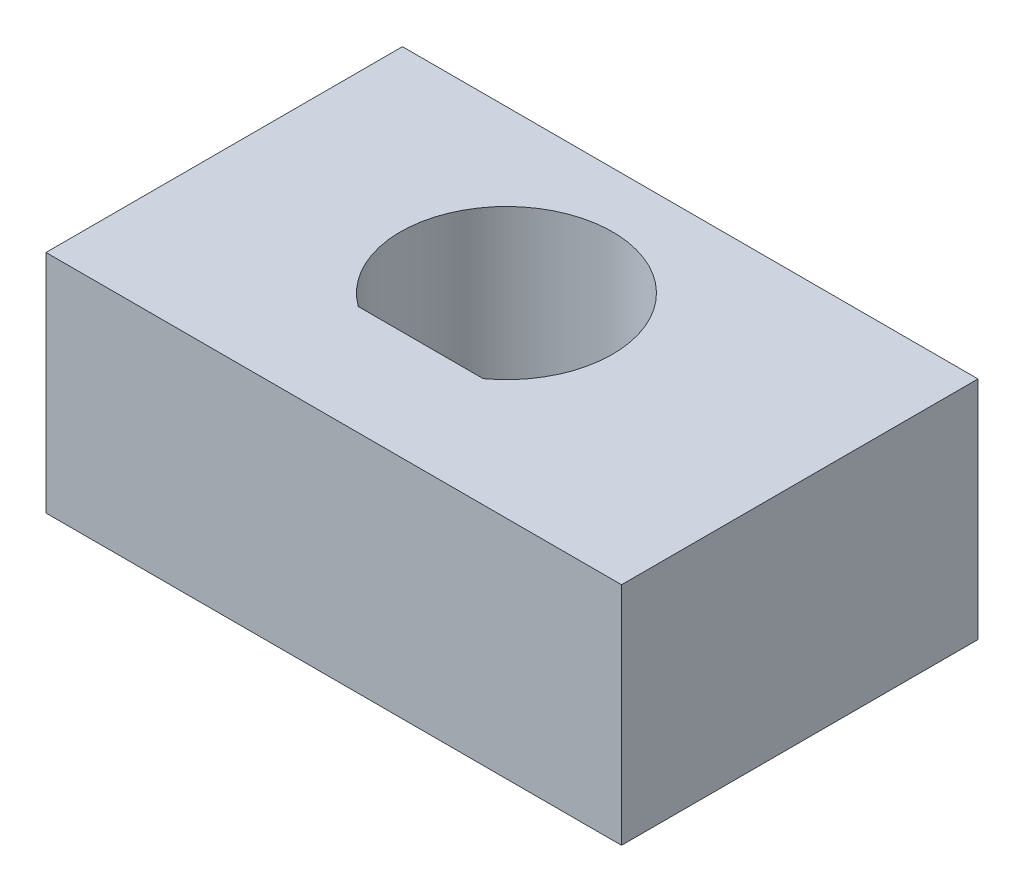
ISO-10303-21;
HEADER;
FILE_DESCRIPTION(('STEP AP214'),'2;1');
FILE_NAME('part.step','',(''),(''),'','','');
FILE_SCHEMA(('AUTOMOTIVE_DESIGN { 1 0 10303 214 1 1 1 1 }'));
ENDSEC;
DATA;
#1=APPLICATION_CONTEXT('core data for automotive mechanical design processes');
#2=APPLICATION_PROTOCOL_DEFINITION('international standard','automotive_design',2000,#1);
#3=PRODUCT_CONTEXT('',#1,'mechanical');
#4=PRODUCT('Part','Part','',(#3));
#5=PRODUCT_RELATED_PRODUCT_CATEGORY('part','',(#4));
#6=PRODUCT_DEFINITION_FORMATION('','',#4);
#7=PRODUCT_DEFINITION_CONTEXT('part definition',#1,'design');
#8=PRODUCT_DEFINITION('design','',#6,#7);
#9=PRODUCT_DEFINITION_SHAPE('','',#8);
#10=(LENGTH_UNIT() NAMED_UNIT(*) SI_UNIT(.MILLI.,.METRE.));
#11=(NAMED_UNIT(*) PLANE_ANGLE_UNIT() SI_UNIT($,.RADIAN.));
#12=(NAMED_UNIT(*) SI_UNIT($,.STERADIAN.) SOLID_ANGLE_UNIT());
#13=UNCERTAINTY_MEASURE_WITH_UNIT(LENGTH_MEASURE(1.E-05),#10,'distance_accuracy_value','');
#14=(GEOMETRIC_REPRESENTATION_CONTEXT(3) GLOBAL_UNCERTAINTY_ASSIGNED_CONTEXT((#13)) GLOBAL_UNIT_ASSIGNED_CONTEXT((#10,
#11,#12)) REPRESENTATION_CONTEXT('',''));
#15=CARTESIAN_POINT('',(0.,0.,0.));
#16=DIRECTION('',(0.,0.,1.));
#17=DIRECTION('',(1.,0.,0.));
#18=AXIS2_PLACEMENT_3D('',#15,#16,#17);
#19=CARTESIAN_POINT('',(0.,10.,0.));
#20=DIRECTION('',(0.,1.,0.));
#21=DIRECTION('',(0.,0.,1.));
#22=AXIS2_PLACEMENT_3D('',#19,#20,#21);
#23=PLANE('',#22);
#24=DIRECTION('',(0.,0.,1.));
#25=VECTOR('',#24,1.);
#26=CARTESIAN_POINT('',(-11.7589503531469,10.,-7.15100613724833));
#27=LINE('',#26,#25);
#28=CARTESIAN_POINT('',(-11.7589503531469,10.,-7.15100613724833));
#29=VERTEX_POINT('',#28);
#30=CARTESIAN_POINT('',(-11.7589503531469,10.,8.64232190253989));
#31=VERTEX_POINT('',#30);
#32=EDGE_CURVE('E115',#29,#31,#27,.T.);
#33=ORIENTED_EDGE('',*,*,#32,.T.);
#34=DIRECTION('',(1.,0.,0.));
#35=VECTOR('',#34,1.);
#36=CARTESIAN_POINT('',(-11.7589503531469,10.,8.64232190253989));
#37=LINE('',#36,#35);
#38=CARTESIAN_POINT('',(13.7404246243508,10.,8.64232190253989));
#39=VERTEX_POINT('',#38);
#40=EDGE_CURVE('E119',#31,#39,#37,.T.);
#41=ORIENTED_EDGE('',*,*,#40,.T.);
#42=DIRECTION('',(0.,0.,-1.));
#43=VECTOR('',#42,1.);
#44=CARTESIAN_POINT('',(13.7404246243508,10.,-7.15100613724833));
#45=LINE('',#44,#43);
#46=CARTESIAN_POINT('',(13.7404246243508,10.,-7.15100613724833));
#47=VERTEX_POINT('',#46);
#48=EDGE_CURVE('E123',#39,#47,#45,.T.);
#49=ORIENTED_EDGE('',*,*,#48,.T.);
#50=DIRECTION('',(-1.,0.,0.));
#51=VECTOR('',#50,1.);
#52=CARTESIAN_POINT('',(-11.7589503531469,10.,-7.15100613724833));
#53=LINE('',#52,#51);
#54=EDGE_CURVE('E126',#47,#29,#53,.T.);
#55=ORIENTED_EDGE('',*,*,#54,.T.);
#56=EDGE_LOOP('',(#33,#41,#49,#55));
#57=FACE_BOUND('',#56,.T.);
#58=DIRECTION('',(1.,0.,0.));
#59=VECTOR('',#58,1.);
#60=CARTESIAN_POINT('',(-2.76586333718787,10.,3.8));
#61=LINE('',#60,#59);
#62=CARTESIAN_POINT('',(-2.76586333718787,10.,3.8));
#63=VERTEX_POINT('',#62);
#64=CARTESIAN_POINT('',(2.76586333718787,10.,3.8));
#65=VERTEX_POINT('',#64);
#66=EDGE_CURVE('E92',#63,#65,#61,.T.);
#67=ORIENTED_EDGE('',*,*,#66,.F.);
#68=CARTESIAN_POINT('',(0.,10.,0.));
#69=DIRECTION('',(0.,1.,0.));
#70=DIRECTION('',(0.,0.,-1.));
#71=AXIS2_PLACEMENT_3D('',#68,#69,#70);
#72=CIRCLE('',#71,4.7);
#73=EDGE_CURVE('E99',#65,#63,#72,.T.);
#74=ORIENTED_EDGE('',*,*,#73,.F.);
#75=EDGE_LOOP('',(#67,#74));
#76=FACE_BOUND('',#75,.T.);
#77=ADVANCED_FACE('F39',(#57,#76),#23,.T.);
#78=CARTESIAN_POINT('',(0.,0.,0.));
#79=DIRECTION('',(0.,1.,0.));
#80=DIRECTION('',(0.,0.,1.));
#81=AXIS2_PLACEMENT_3D('',#78,#79,#80);
#82=PLANE('',#81);
#83=DIRECTION('',(0.,0.,1.));
#84=VECTOR('',#83,1.);
#85=CARTESIAN_POINT('',(-11.7589503531469,0.,-7.15100613724833));
#86=LINE('',#85,#84);
#87=CARTESIAN_POINT('',(-11.7589503531469,0.,-7.15100613724833));
#88=VERTEX_POINT('',#87);
#89=CARTESIAN_POINT('',(-11.7589503531469,0.,8.64232190253989));
#90=VERTEX_POINT('',#89);
#91=EDGE_CURVE('E114',#88,#90,#86,.T.);
#92=ORIENTED_EDGE('',*,*,#91,.F.);
#93=DIRECTION('',(-1.,0.,0.));
#94=VECTOR('',#93,1.);
#95=CARTESIAN_POINT('',(-11.7589503531469,0.,-7.15100613724833));
#96=LINE('',#95,#94);
#97=CARTESIAN_POINT('',(13.7404246243508,0.,-7.15100613724833));
#98=VERTEX_POINT('',#97);
#99=EDGE_CURVE('E120',#98,#88,#96,.T.);
#100=ORIENTED_EDGE('',*,*,#99,.F.);
#101=DIRECTION('',(0.,0.,-1.));
#102=VECTOR('',#101,1.);
#103=CARTESIAN_POINT('',(13.7404246243508,0.,-7.15100613724833));
#104=LINE('',#103,#102);
#105=CARTESIAN_POINT('',(13.7404246243508,0.,8.64232190253989));
#106=VERTEX_POINT('',#105);
#107=EDGE_CURVE('E136',#106,#98,#104,.T.);
#108=ORIENTED_EDGE('',*,*,#107,.F.);
#109=DIRECTION('',(1.,0.,0.));
#110=VECTOR('',#109,1.);
#111=CARTESIAN_POINT('',(-11.7589503531469,0.,8.64232190253989));
#112=LINE('',#111,#110);
#113=EDGE_CURVE('E133',#90,#106,#112,.T.);
#114=ORIENTED_EDGE('',*,*,#113,.F.);
#115=EDGE_LOOP('',(#92,#100,#108,#114));
#116=FACE_BOUND('',#115,.T.);
#117=CARTESIAN_POINT('',(0.,0.,0.));
#118=DIRECTION('',(0.,1.,0.));
#119=DIRECTION('',(0.,0.,-1.));
#120=AXIS2_PLACEMENT_3D('',#117,#118,#119);
#121=CIRCLE('',#120,4.7);
#122=CARTESIAN_POINT('',(2.76586333718787,0.,3.8));
#123=VERTEX_POINT('',#122);
#124=CARTESIAN_POINT('',(-2.76586333718787,0.,3.8));
#125=VERTEX_POINT('',#124);
#126=EDGE_CURVE('E62',#123,#125,#121,.T.);
#127=ORIENTED_EDGE('',*,*,#126,.T.);
#128=DIRECTION('',(1.,0.,0.));
#129=VECTOR('',#128,1.);
#130=CARTESIAN_POINT('',(-2.76586333718787,0.,3.8));
#131=LINE('',#130,#129);
#132=EDGE_CURVE('E105',#125,#123,#131,.T.);
#133=ORIENTED_EDGE('',*,*,#132,.T.);
#134=EDGE_LOOP('',(#127,#133));
#135=FACE_BOUND('',#134,.T.);
#136=ADVANCED_FACE('F159',(#116,#135),#82,.F.);
#137=CARTESIAN_POINT('',(-11.7589503531469,10.,-7.15100613724833));
#138=DIRECTION('',(1.,0.,0.));
#139=DIRECTION('',(0.,0.,-1.));
#140=AXIS2_PLACEMENT_3D('',#137,#138,#139);
#141=PLANE('',#140);
#142=ORIENTED_EDGE('',*,*,#91,.T.);
#143=DIRECTION('',(0.,-1.,0.));
#144=VECTOR('',#143,1.);
#145=CARTESIAN_POINT('',(-11.7589503531469,10.,8.64232190253989));
#146=LINE('',#145,#144);
#147=EDGE_CURVE('E11',#31,#90,#146,.T.);
#148=ORIENTED_EDGE('',*,*,#147,.F.);
#149=ORIENTED_EDGE('',*,*,#32,.F.);
#150=DIRECTION('',(0.,-1.,0.));
#151=VECTOR('',#150,1.);
#152=CARTESIAN_POINT('',(-11.7589503531469,10.,-7.15100613724833));
#153=LINE('',#152,#151);
#154=EDGE_CURVE('E129',#29,#88,#153,.T.);
#155=ORIENTED_EDGE('',*,*,#154,.T.);
#156=EDGE_LOOP('',(#142,#148,#149,#155));
#157=FACE_BOUND('',#156,.T.);
#158=ADVANCED_FACE('F41',(#157),#141,.F.);
#159=CARTESIAN_POINT('',(-11.7589503531469,10.,8.64232190253989));
#160=DIRECTION('',(0.,0.,-1.));
#161=DIRECTION('',(-1.,0.,0.));
#162=AXIS2_PLACEMENT_3D('',#159,#160,#161);
#163=PLANE('',#162);
#164=ORIENTED_EDGE('',*,*,#113,.T.);
#165=DIRECTION('',(0.,-1.,0.));
#166=VECTOR('',#165,1.);
#167=CARTESIAN_POINT('',(13.7404246243508,10.,8.64232190253989));
#168=LINE('',#167,#166);
#169=EDGE_CURVE('E48',#39,#106,#168,.T.);
#170=ORIENTED_EDGE('',*,*,#169,.F.);
#171=ORIENTED_EDGE('',*,*,#40,.F.);
#172=ORIENTED_EDGE('',*,*,#147,.T.);
#173=EDGE_LOOP('',(#164,#170,#171,#172));
#174=FACE_BOUND('',#173,.T.);
#175=ADVANCED_FACE('F169',(#174),#163,.F.);
#176=CARTESIAN_POINT('',(13.7404246243508,10.,-7.15100613724833));
#177=DIRECTION('',(-1.,0.,0.));
#178=DIRECTION('',(0.,0.,1.));
#179=AXIS2_PLACEMENT_3D('',#176,#177,#178);
#180=PLANE('',#179);
#181=ORIENTED_EDGE('',*,*,#107,.T.);
#182=DIRECTION('',(0.,-1.,0.));
#183=VECTOR('',#182,1.);
#184=CARTESIAN_POINT('',(13.7404246243508,10.,-7.15100613724833));
#185=LINE('',#184,#183);
#186=EDGE_CURVE('E144',#47,#98,#185,.T.);
#187=ORIENTED_EDGE('',*,*,#186,.F.);
#188=ORIENTED_EDGE('',*,*,#48,.F.);
#189=ORIENTED_EDGE('',*,*,#169,.T.);
#190=EDGE_LOOP('',(#181,#187,#188,#189));
#191=FACE_BOUND('',#190,.T.);
#192=ADVANCED_FACE('F153',(#191),#180,.F.);
#193=CARTESIAN_POINT('',(-11.7589503531469,10.,-7.15100613724833));
#194=DIRECTION('',(0.,0.,1.));
#195=DIRECTION('',(1.,0.,0.));
#196=AXIS2_PLACEMENT_3D('',#193,#194,#195);
#197=PLANE('',#196);
#198=ORIENTED_EDGE('',*,*,#99,.T.);
#199=ORIENTED_EDGE('',*,*,#154,.F.);
#200=ORIENTED_EDGE('',*,*,#54,.F.);
#201=ORIENTED_EDGE('',*,*,#186,.T.);
#202=EDGE_LOOP('',(#198,#199,#200,#201));
#203=FACE_BOUND('',#202,.T.);
#204=ADVANCED_FACE('F163',(#203),#197,.F.);
#205=CARTESIAN_POINT('',(0.,10.,0.));
#206=DIRECTION('',(0.,-1.,0.));
#207=DIRECTION('',(0.,0.,-1.));
#208=AXIS2_PLACEMENT_3D('',#205,#206,#207);
#209=CYLINDRICAL_SURFACE('',#208,4.7);
#210=ORIENTED_EDGE('',*,*,#126,.F.);
#211=DIRECTION('',(0.,-1.,0.));
#212=VECTOR('',#211,1.);
#213=CARTESIAN_POINT('',(2.76586333718787,10.,3.8));
#214=LINE('',#213,#212);
#215=EDGE_CURVE('E94',#65,#123,#214,.T.);
#216=ORIENTED_EDGE('',*,*,#215,.F.);
#217=ORIENTED_EDGE('',*,*,#73,.T.);
#218=DIRECTION('',(0.,-1.,0.));
#219=VECTOR('',#218,1.);
#220=CARTESIAN_POINT('',(-2.76586333718787,10.,3.8));
#221=LINE('',#220,#219);
#222=EDGE_CURVE('E55',#63,#125,#221,.T.);
#223=ORIENTED_EDGE('',*,*,#222,.T.);
#224=EDGE_LOOP('',(#210,#216,#217,#223));
#225=FACE_BOUND('',#224,.T.);
#226=ADVANCED_FACE('F101',(#225),#209,.F.);
#227=CARTESIAN_POINT('',(-2.76586333718787,10.,3.8));
#228=DIRECTION('',(0.,0.,-1.));
#229=DIRECTION('',(-1.,0.,0.));
#230=AXIS2_PLACEMENT_3D('',#227,#228,#229);
#231=PLANE('',#230);
#232=ORIENTED_EDGE('',*,*,#132,.F.);
#233=ORIENTED_EDGE('',*,*,#222,.F.);
#234=ORIENTED_EDGE('',*,*,#66,.T.);
#235=ORIENTED_EDGE('',*,*,#215,.T.);
#236=EDGE_LOOP('',(#232,#233,#234,#235));
#237=FACE_BOUND('',#236,.T.);
#238=ADVANCED_FACE('F93',(#237),#231,.T.);
#239=CLOSED_SHELL('',(#77,#136,#158,#175,#192,#204,#226,#238));
#240=MANIFOLD_SOLID_BREP('B2',#239);
#241=ADVANCED_BREP_SHAPE_REPRESENTATION('',(#18,#240),#14);
#242=SHAPE_DEFINITION_REPRESENTATION(#9,#241);
ENDSEC;
END-ISO-10303-21;
